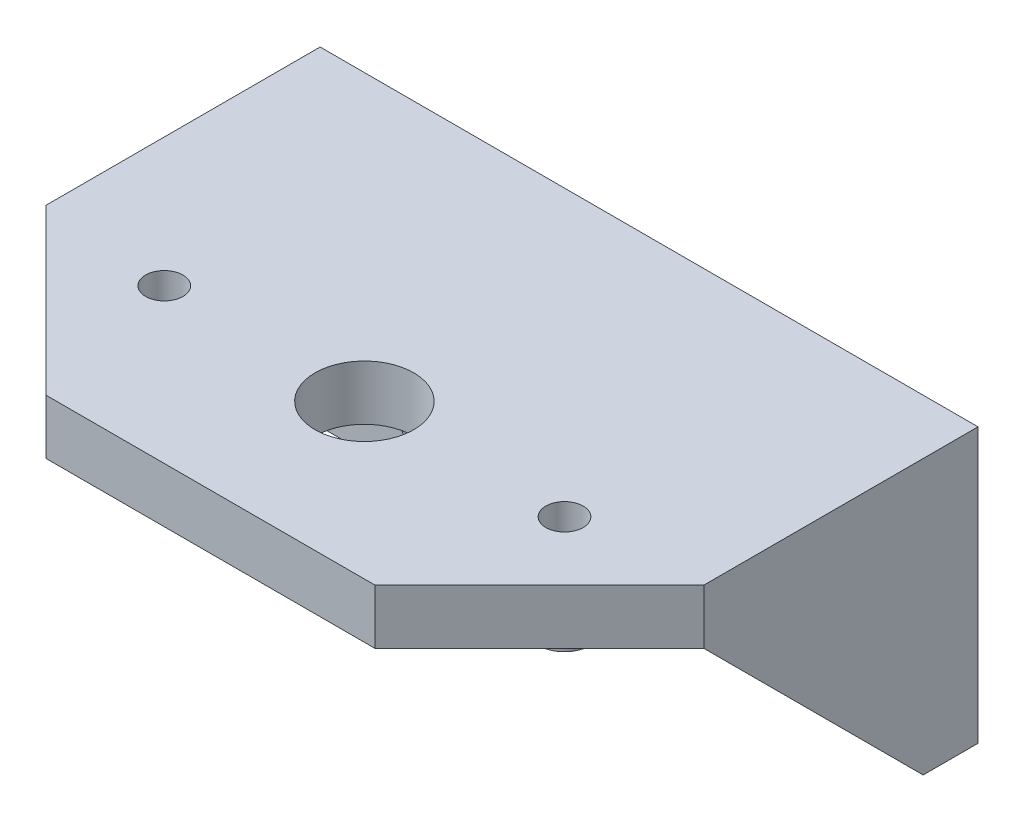
ISO-10303-21;
HEADER;
FILE_DESCRIPTION(('STEP AP214'),'2;1');
FILE_NAME('part.step','',(''),(''),'','','');
FILE_SCHEMA(('AUTOMOTIVE_DESIGN { 1 0 10303 214 1 1 1 1 }'));
ENDSEC;
DATA;
#1=APPLICATION_CONTEXT('core data for automotive mechanical design processes');
#2=APPLICATION_PROTOCOL_DEFINITION('international standard','automotive_design',2000,#1);
#3=PRODUCT_CONTEXT('',#1,'mechanical');
#4=PRODUCT('Part','Part','',(#3));
#5=PRODUCT_RELATED_PRODUCT_CATEGORY('part','',(#4));
#6=PRODUCT_DEFINITION_FORMATION('','',#4);
#7=PRODUCT_DEFINITION_CONTEXT('part definition',#1,'design');
#8=PRODUCT_DEFINITION('design','',#6,#7);
#9=PRODUCT_DEFINITION_SHAPE('','',#8);
#10=(LENGTH_UNIT() NAMED_UNIT(*) SI_UNIT(.MILLI.,.METRE.));
#11=(NAMED_UNIT(*) PLANE_ANGLE_UNIT() SI_UNIT($,.RADIAN.));
#12=(NAMED_UNIT(*) SI_UNIT($,.STERADIAN.) SOLID_ANGLE_UNIT());
#13=UNCERTAINTY_MEASURE_WITH_UNIT(LENGTH_MEASURE(1.E-05),#10,'distance_accuracy_value','');
#14=(GEOMETRIC_REPRESENTATION_CONTEXT(3) GLOBAL_UNCERTAINTY_ASSIGNED_CONTEXT((#13)) GLOBAL_UNIT_ASSIGNED_CONTEXT((#10,
#11,#12)) REPRESENTATION_CONTEXT('',''));
#15=CARTESIAN_POINT('',(0.,0.,0.));
#16=DIRECTION('',(0.,0.,1.));
#17=DIRECTION('',(1.,0.,0.));
#18=AXIS2_PLACEMENT_3D('',#15,#16,#17);
#19=CARTESIAN_POINT('',(0.,0.,5.));
#20=DIRECTION('',(0.,0.,1.));
#21=DIRECTION('',(1.,0.,0.));
#22=AXIS2_PLACEMENT_3D('',#19,#20,#21);
#23=PLANE('',#22);
#24=CARTESIAN_POINT('',(96.6237661627141,215.923622409628,5.));
#25=DIRECTION('',(0.,0.,1.));
#26=DIRECTION('',(1.,0.,0.));
#27=AXIS2_PLACEMENT_3D('',#24,#25,#26);
#28=CIRCLE('',#27,3.00000000000001);
#29=CARTESIAN_POINT('',(99.6237661627141,215.923622409628,5.));
#30=VERTEX_POINT('',#29);
#31=EDGE_CURVE('E178',#30,#30,#28,.T.);
#32=ORIENTED_EDGE('',*,*,#31,.F.);
#33=EDGE_LOOP('',(#32));
#34=FACE_BOUND('',#33,.T.);
#35=CARTESIAN_POINT('',(96.6237661627141,225.923622409628,5.));
#36=DIRECTION('',(0.,0.,1.));
#37=DIRECTION('',(1.,0.,0.));
#38=AXIS2_PLACEMENT_3D('',#35,#36,#37);
#39=CIRCLE('',#38,3.00000000000001);
#40=CARTESIAN_POINT('',(99.6237661627141,225.923622409628,5.));
#41=VERTEX_POINT('',#40);
#42=EDGE_CURVE('E189',#41,#41,#39,.T.);
#43=ORIENTED_EDGE('',*,*,#42,.F.);
#44=EDGE_LOOP('',(#43));
#45=FACE_BOUND('',#44,.T.);
#46=CARTESIAN_POINT('',(126.623766162714,225.9236224096,5.));
#47=DIRECTION('',(0.,0.,1.));
#48=DIRECTION('',(1.,0.,0.));
#49=AXIS2_PLACEMENT_3D('',#46,#47,#48);
#50=CIRCLE('',#49,3.0000000000083);
#51=CARTESIAN_POINT('',(129.623766162722,225.9236224096,5.));
#52=VERTEX_POINT('',#51);
#53=EDGE_CURVE('E183',#52,#52,#50,.T.);
#54=ORIENTED_EDGE('',*,*,#53,.F.);
#55=EDGE_LOOP('',(#54));
#56=FACE_BOUND('',#55,.T.);
#57=CARTESIAN_POINT('',(126.623766162714,215.923622409628,5.));
#58=DIRECTION('',(0.,0.,1.));
#59=DIRECTION('',(1.,0.,0.));
#60=AXIS2_PLACEMENT_3D('',#57,#58,#59);
#61=CIRCLE('',#60,2.99999999999999);
#62=CARTESIAN_POINT('',(129.623766162714,215.923622409628,5.));
#63=VERTEX_POINT('',#62);
#64=EDGE_CURVE('E182',#63,#63,#61,.T.);
#65=ORIENTED_EDGE('',*,*,#64,.F.);
#66=EDGE_LOOP('',(#65));
#67=FACE_BOUND('',#66,.T.);
#68=DIRECTION('',(1.,0.,0.));
#69=VECTOR('',#68,1.);
#70=CARTESIAN_POINT('',(0.,210.923622409628,5.));
#71=LINE('',#70,#69);
#72=CARTESIAN_POINT('',(84.6237661627141,210.923622409628,5.));
#73=VERTEX_POINT('',#72);
#74=CARTESIAN_POINT('',(138.623766162714,210.923622409628,5.));
#75=VERTEX_POINT('',#74);
#76=EDGE_CURVE('E222',#73,#75,#71,.T.);
#77=ORIENTED_EDGE('',*,*,#76,.T.);
#78=DIRECTION('',(0.,1.,0.));
#79=VECTOR('',#78,1.);
#80=CARTESIAN_POINT('',(138.623766162714,0.,5.));
#81=LINE('',#80,#79);
#82=CARTESIAN_POINT('',(138.623766162714,230.9236224096,5.));
#83=VERTEX_POINT('',#82);
#84=EDGE_CURVE('E59',#75,#83,#81,.T.);
#85=ORIENTED_EDGE('',*,*,#84,.T.);
#86=DIRECTION('',(1.,0.,0.));
#87=VECTOR('',#86,1.);
#88=CARTESIAN_POINT('',(-6.4861517815857E-13,230.9236224096,5.));
#89=LINE('',#88,#87);
#90=CARTESIAN_POINT('',(84.6237661627141,230.9236224096,5.));
#91=VERTEX_POINT('',#90);
#92=EDGE_CURVE('E206',#91,#83,#89,.T.);
#93=ORIENTED_EDGE('',*,*,#92,.F.);
#94=DIRECTION('',(0.,-1.,0.));
#95=VECTOR('',#94,1.);
#96=CARTESIAN_POINT('',(84.6237661627141,0.,5.));
#97=LINE('',#96,#95);
#98=EDGE_CURVE('E155',#91,#73,#97,.T.);
#99=ORIENTED_EDGE('',*,*,#98,.T.);
#100=EDGE_LOOP('',(#77,#85,#93,#99));
#101=FACE_BOUND('',#100,.T.);
#102=ADVANCED_FACE('F36',(#34,#45,#56,#67,#101),#23,.T.);
#103=CARTESIAN_POINT('',(-6.4861517815857E-13,230.9236224096,0.));
#104=DIRECTION('',(0.,1.,0.));
#105=DIRECTION('',(-1.,0.,0.));
#106=AXIS2_PLACEMENT_3D('',#103,#104,#105);
#107=PLANE('',#106);
#108=CARTESIAN_POINT('',(93.3737661626332,230.9236224096,25.9618967854097));
#109=DIRECTION('',(0.,1.,0.));
#110=DIRECTION('',(-1.,0.,0.));
#111=AXIS2_PLACEMENT_3D('',#108,#109,#110);
#112=CIRCLE('',#111,4.35000000000008);
#113=CARTESIAN_POINT('',(89.0237661626332,230.9236224096,25.9618967854097));
#114=VERTEX_POINT('',#113);
#115=EDGE_CURVE('E44',#114,#114,#112,.T.);
#116=ORIENTED_EDGE('',*,*,#115,.T.);
#117=EDGE_LOOP('',(#116));
#118=FACE_BOUND('',#117,.T.);
#119=CARTESIAN_POINT('',(129.873766162714,230.9236224096,25.96189678543));
#120=DIRECTION('',(0.,1.,0.));
#121=DIRECTION('',(-1.,0.,0.));
#122=AXIS2_PLACEMENT_3D('',#119,#120,#121);
#123=CIRCLE('',#122,4.35000000000005);
#124=CARTESIAN_POINT('',(125.523766162714,230.9236224096,25.96189678543));
#125=VERTEX_POINT('',#124);
#126=EDGE_CURVE('E278',#125,#125,#123,.T.);
#127=ORIENTED_EDGE('',*,*,#126,.T.);
#128=EDGE_LOOP('',(#127));
#129=FACE_BOUND('',#128,.T.);
#130=CARTESIAN_POINT('',(111.623766162714,230.9236224096,25.9618967848771));
#131=DIRECTION('',(0.,1.,0.));
#132=DIRECTION('',(-1.,0.,0.));
#133=AXIS2_PLACEMENT_3D('',#130,#131,#132);
#134=CIRCLE('',#133,4.4999999998442);
#135=CARTESIAN_POINT('',(107.12376616287,230.9236224096,25.9618967848771));
#136=VERTEX_POINT('',#135);
#137=EDGE_CURVE('E203',#136,#136,#134,.T.);
#138=ORIENTED_EDGE('',*,*,#137,.T.);
#139=EDGE_LOOP('',(#138));
#140=FACE_BOUND('',#139,.T.);
#141=DIRECTION('',(0.,0.,-1.));
#142=VECTOR('',#141,1.);
#143=CARTESIAN_POINT('',(138.623766162714,230.9236224096,0.));
#144=LINE('',#143,#142);
#145=CARTESIAN_POINT('',(138.623766162714,230.9236224096,24.9999999999999));
#146=VERTEX_POINT('',#145);
#147=EDGE_CURVE('E51',#146,#83,#144,.T.);
#148=ORIENTED_EDGE('',*,*,#147,.F.);
#149=DIRECTION('',(1.,0.,0.));
#150=VECTOR('',#149,1.);
#151=CARTESIAN_POINT('',(138.623766162714,230.9236224096,24.9999999999999));
#152=LINE('',#151,#150);
#153=CARTESIAN_POINT('',(141.623766162714,230.9236224096,24.9999999999999));
#154=VERTEX_POINT('',#153);
#155=EDGE_CURVE('E135',#146,#154,#152,.T.);
#156=ORIENTED_EDGE('',*,*,#155,.T.);
#157=DIRECTION('',(-0.707106781186548,0.,0.707106781186548));
#158=VECTOR('',#157,1.);
#159=CARTESIAN_POINT('',(126.623766162714,230.9236224096,40.));
#160=LINE('',#159,#158);
#161=CARTESIAN_POINT('',(126.623766162714,230.9236224096,40.));
#162=VERTEX_POINT('',#161);
#163=EDGE_CURVE('E270',#154,#162,#160,.T.);
#164=ORIENTED_EDGE('',*,*,#163,.T.);
#165=DIRECTION('',(1.,0.,0.));
#166=VECTOR('',#165,1.);
#167=CARTESIAN_POINT('',(-6.4861517815857E-13,230.9236224096,40.));
#168=LINE('',#167,#166);
#169=CARTESIAN_POINT('',(96.6237661627142,230.9236224096,40.));
#170=VERTEX_POINT('',#169);
#171=EDGE_CURVE('E209',#170,#162,#168,.T.);
#172=ORIENTED_EDGE('',*,*,#171,.F.);
#173=DIRECTION('',(0.707106781186548,0.,0.707106781186547));
#174=VECTOR('',#173,1.);
#175=CARTESIAN_POINT('',(81.6237661627138,230.9236224096,24.9999999999996));
#176=LINE('',#175,#174);
#177=CARTESIAN_POINT('',(81.6237661627141,230.9236224096,25.));
#178=VERTEX_POINT('',#177);
#179=EDGE_CURVE('E267',#170,#178,#176,.F.);
#180=ORIENTED_EDGE('',*,*,#179,.T.);
#181=DIRECTION('',(-1.,0.,0.));
#182=VECTOR('',#181,1.);
#183=CARTESIAN_POINT('',(84.6237661627141,230.9236224096,25.));
#184=LINE('',#183,#182);
#185=CARTESIAN_POINT('',(84.6237661627141,230.9236224096,25.));
#186=VERTEX_POINT('',#185);
#187=EDGE_CURVE('E152',#186,#178,#184,.T.);
#188=ORIENTED_EDGE('',*,*,#187,.F.);
#189=DIRECTION('',(0.,0.,1.));
#190=VECTOR('',#189,1.);
#191=CARTESIAN_POINT('',(84.6237661627141,230.9236224096,0.));
#192=LINE('',#191,#190);
#193=EDGE_CURVE('E158',#91,#186,#192,.T.);
#194=ORIENTED_EDGE('',*,*,#193,.F.);
#195=ORIENTED_EDGE('',*,*,#92,.T.);
#196=EDGE_LOOP('',(#148,#156,#164,#172,#180,#188,#194,#195));
#197=FACE_BOUND('',#196,.T.);
#198=ADVANCED_FACE('F283',(#118,#129,#140,#197),#107,.F.);
#199=CARTESIAN_POINT('',(96.6237661627141,225.923622409628,5.));
#200=DIRECTION('',(0.,0.,-1.));
#201=DIRECTION('',(-1.,0.,0.));
#202=AXIS2_PLACEMENT_3D('',#199,#200,#201);
#203=CYLINDRICAL_SURFACE('',#202,1.70000000000001);
#204=CARTESIAN_POINT('',(96.6237661627141,225.923622409628,0.));
#205=DIRECTION('',(0.,0.,1.));
#206=DIRECTION('',(1.,0.,0.));
#207=AXIS2_PLACEMENT_3D('',#204,#205,#206);
#208=CIRCLE('',#207,1.70000000000001);
#209=CARTESIAN_POINT('',(98.3237661627142,225.923622409628,0.));
#210=VERTEX_POINT('',#209);
#211=EDGE_CURVE('E237',#210,#210,#208,.T.);
#212=ORIENTED_EDGE('',*,*,#211,.F.);
#213=EDGE_LOOP('',(#212));
#214=FACE_BOUND('',#213,.T.);
#215=CARTESIAN_POINT('',(96.6237661627141,225.923622409628,2.));
#216=DIRECTION('',(0.,0.,1.));
#217=DIRECTION('',(1.,0.,0.));
#218=AXIS2_PLACEMENT_3D('',#215,#216,#217);
#219=CIRCLE('',#218,1.70000000000001);
#220=CARTESIAN_POINT('',(98.3237661627142,225.923622409628,2.));
#221=VERTEX_POINT('',#220);
#222=EDGE_CURVE('E215',#221,#221,#219,.T.);
#223=ORIENTED_EDGE('',*,*,#222,.T.);
#224=EDGE_LOOP('',(#223));
#225=FACE_BOUND('',#224,.T.);
#226=ADVANCED_FACE('F323',(#214,#225),#203,.F.);
#227=CARTESIAN_POINT('',(126.623766162714,225.9236224096,5.));
#228=DIRECTION('',(0.,0.,-1.));
#229=DIRECTION('',(-1.,0.,0.));
#230=AXIS2_PLACEMENT_3D('',#227,#228,#229);
#231=CYLINDRICAL_SURFACE('',#230,1.70000000000832);
#232=CARTESIAN_POINT('',(126.623766162714,225.9236224096,0.));
#233=DIRECTION('',(0.,0.,1.));
#234=DIRECTION('',(1.,0.,0.));
#235=AXIS2_PLACEMENT_3D('',#232,#233,#234);
#236=CIRCLE('',#235,1.70000000000832);
#237=CARTESIAN_POINT('',(128.323766162722,225.9236224096,0.));
#238=VERTEX_POINT('',#237);
#239=EDGE_CURVE('E234',#238,#238,#236,.T.);
#240=ORIENTED_EDGE('',*,*,#239,.F.);
#241=EDGE_LOOP('',(#240));
#242=FACE_BOUND('',#241,.T.);
#243=CARTESIAN_POINT('',(126.623766162714,225.9236224096,2.));
#244=DIRECTION('',(0.,0.,1.));
#245=DIRECTION('',(1.,0.,0.));
#246=AXIS2_PLACEMENT_3D('',#243,#244,#245);
#247=CIRCLE('',#246,1.70000000000832);
#248=CARTESIAN_POINT('',(128.323766162722,225.9236224096,2.));
#249=VERTEX_POINT('',#248);
#250=EDGE_CURVE('E253',#249,#249,#247,.T.);
#251=ORIENTED_EDGE('',*,*,#250,.T.);
#252=EDGE_LOOP('',(#251));
#253=FACE_BOUND('',#252,.T.);
#254=ADVANCED_FACE('F344',(#242,#253),#231,.F.);
#255=CARTESIAN_POINT('',(126.623766162714,215.923622409628,5.));
#256=DIRECTION('',(0.,0.,-1.));
#257=DIRECTION('',(-1.,0.,0.));
#258=AXIS2_PLACEMENT_3D('',#255,#256,#257);
#259=CYLINDRICAL_SURFACE('',#258,1.70000000000001);
#260=CARTESIAN_POINT('',(126.623766162714,215.923622409628,0.));
#261=DIRECTION('',(0.,0.,1.));
#262=DIRECTION('',(1.,0.,0.));
#263=AXIS2_PLACEMENT_3D('',#260,#261,#262);
#264=CIRCLE('',#263,1.70000000000001);
#265=CARTESIAN_POINT('',(128.323766162714,215.923622409628,0.));
#266=VERTEX_POINT('',#265);
#267=EDGE_CURVE('E231',#266,#266,#264,.T.);
#268=ORIENTED_EDGE('',*,*,#267,.F.);
#269=EDGE_LOOP('',(#268));
#270=FACE_BOUND('',#269,.T.);
#271=CARTESIAN_POINT('',(126.623766162714,215.923622409628,2.));
#272=DIRECTION('',(0.,0.,1.));
#273=DIRECTION('',(1.,0.,0.));
#274=AXIS2_PLACEMENT_3D('',#271,#272,#273);
#275=CIRCLE('',#274,1.70000000000001);
#276=CARTESIAN_POINT('',(128.323766162714,215.923622409628,2.));
#277=VERTEX_POINT('',#276);
#278=EDGE_CURVE('E250',#277,#277,#275,.T.);
#279=ORIENTED_EDGE('',*,*,#278,.T.);
#280=EDGE_LOOP('',(#279));
#281=FACE_BOUND('',#280,.T.);
#282=ADVANCED_FACE('F340',(#270,#281),#259,.F.);
#283=CARTESIAN_POINT('',(96.6237661627141,215.923622409628,5.));
#284=DIRECTION('',(0.,0.,-1.));
#285=DIRECTION('',(-1.,0.,0.));
#286=AXIS2_PLACEMENT_3D('',#283,#284,#285);
#287=CYLINDRICAL_SURFACE('',#286,1.70000000000001);
#288=CARTESIAN_POINT('',(96.6237661627141,215.923622409628,0.));
#289=DIRECTION('',(0.,0.,1.));
#290=DIRECTION('',(1.,0.,0.));
#291=AXIS2_PLACEMENT_3D('',#288,#289,#290);
#292=CIRCLE('',#291,1.70000000000001);
#293=CARTESIAN_POINT('',(98.3237661627142,215.923622409628,0.));
#294=VERTEX_POINT('',#293);
#295=EDGE_CURVE('E240',#294,#294,#292,.T.);
#296=ORIENTED_EDGE('',*,*,#295,.F.);
#297=EDGE_LOOP('',(#296));
#298=FACE_BOUND('',#297,.T.);
#299=CARTESIAN_POINT('',(96.6237661627141,215.923622409628,2.));
#300=DIRECTION('',(0.,0.,1.));
#301=DIRECTION('',(1.,0.,0.));
#302=AXIS2_PLACEMENT_3D('',#299,#300,#301);
#303=CIRCLE('',#302,1.70000000000001);
#304=CARTESIAN_POINT('',(98.3237661627142,215.923622409628,2.));
#305=VERTEX_POINT('',#304);
#306=EDGE_CURVE('E200',#305,#305,#303,.T.);
#307=ORIENTED_EDGE('',*,*,#306,.T.);
#308=EDGE_LOOP('',(#307));
#309=FACE_BOUND('',#308,.T.);
#310=ADVANCED_FACE('F337',(#298,#309),#287,.F.);
#311=CARTESIAN_POINT('',(0.,210.923622409628,5.));
#312=DIRECTION('',(0.,1.,0.));
#313=DIRECTION('',(0.,0.,1.));
#314=AXIS2_PLACEMENT_3D('',#311,#312,#313);
#315=PLANE('',#314);
#316=DIRECTION('',(1.,0.,0.));
#317=VECTOR('',#316,1.);
#318=CARTESIAN_POINT('',(138.623766162714,210.923622409628,5.));
#319=LINE('',#318,#317);
#320=CARTESIAN_POINT('',(141.623766162714,210.923622409628,5.));
#321=VERTEX_POINT('',#320);
#322=EDGE_CURVE('E118',#75,#321,#319,.T.);
#323=ORIENTED_EDGE('',*,*,#322,.F.);
#324=ORIENTED_EDGE('',*,*,#76,.F.);
#325=CARTESIAN_POINT('',(81.6237661627141,210.923622409628,5.));
#326=VERTEX_POINT('',#325);
#327=EDGE_CURVE('E218',#326,#73,#71,.T.);
#328=ORIENTED_EDGE('',*,*,#327,.F.);
#329=DIRECTION('',(0.,0.,-1.));
#330=VECTOR('',#329,1.);
#331=CARTESIAN_POINT('',(81.6237661627141,210.923622409628,5.));
#332=LINE('',#331,#330);
#333=CARTESIAN_POINT('',(81.6237661627141,210.923622409628,0.));
#334=VERTEX_POINT('',#333);
#335=EDGE_CURVE('E221',#326,#334,#332,.T.);
#336=ORIENTED_EDGE('',*,*,#335,.T.);
#337=DIRECTION('',(1.,0.,0.));
#338=VECTOR('',#337,1.);
#339=CARTESIAN_POINT('',(0.,210.923622409628,0.));
#340=LINE('',#339,#338);
#341=CARTESIAN_POINT('',(141.623766162714,210.923622409628,0.));
#342=VERTEX_POINT('',#341);
#343=EDGE_CURVE('E120',#334,#342,#340,.T.);
#344=ORIENTED_EDGE('',*,*,#343,.T.);
#345=DIRECTION('',(0.,0.,-1.));
#346=VECTOR('',#345,1.);
#347=CARTESIAN_POINT('',(141.623766162714,210.923622409628,5.));
#348=LINE('',#347,#346);
#349=EDGE_CURVE('E114',#321,#342,#348,.T.);
#350=ORIENTED_EDGE('',*,*,#349,.F.);
#351=EDGE_LOOP('',(#323,#324,#328,#336,#344,#350));
#352=FACE_BOUND('',#351,.T.);
#353=ADVANCED_FACE('F116',(#352),#315,.F.);
#354=CARTESIAN_POINT('',(141.623766162714,0.,5.));
#355=DIRECTION('',(-1.,0.,0.));
#356=DIRECTION('',(0.,0.,1.));
#357=AXIS2_PLACEMENT_3D('',#354,#355,#356);
#358=PLANE('',#357);
#359=DIRECTION('',(0.,0.,-1.));
#360=VECTOR('',#359,1.);
#361=CARTESIAN_POINT('',(141.623766162714,235.9236224096,5.));
#362=LINE('',#361,#360);
#363=CARTESIAN_POINT('',(141.623766162714,235.9236224096,24.9999999999999));
#364=VERTEX_POINT('',#363);
#365=CARTESIAN_POINT('',(141.623766162714,235.9236224096,0.));
#366=VERTEX_POINT('',#365);
#367=EDGE_CURVE('E126',#364,#366,#362,.T.);
#368=ORIENTED_EDGE('',*,*,#367,.F.);
#369=DIRECTION('',(0.,-1.,0.));
#370=VECTOR('',#369,1.);
#371=CARTESIAN_POINT('',(141.623766162714,230.9236224096,24.9999999999999));
#372=LINE('',#371,#370);
#373=EDGE_CURVE('E141',#364,#154,#372,.T.);
#374=ORIENTED_EDGE('',*,*,#373,.T.);
#375=DIRECTION('',(0.,0.707106781186055,0.70710678118704));
#376=VECTOR('',#375,1.);
#377=CARTESIAN_POINT('',(141.623766162714,102.961811204961,-102.961811204817));
#378=LINE('',#377,#376);
#379=EDGE_CURVE('E133',#321,#154,#378,.T.);
#380=ORIENTED_EDGE('',*,*,#379,.F.);
#381=ORIENTED_EDGE('',*,*,#349,.T.);
#382=DIRECTION('',(0.,1.,0.));
#383=VECTOR('',#382,1.);
#384=CARTESIAN_POINT('',(141.623766162714,0.,0.));
#385=LINE('',#384,#383);
#386=EDGE_CURVE('E224',#342,#366,#385,.T.);
#387=ORIENTED_EDGE('',*,*,#386,.T.);
#388=EDGE_LOOP('',(#368,#374,#380,#381,#387));
#389=FACE_BOUND('',#388,.T.);
#390=ADVANCED_FACE('F139',(#389),#358,.F.);
#391=CARTESIAN_POINT('',(0.,235.9236224096,5.));
#392=DIRECTION('',(0.,1.,0.));
#393=DIRECTION('',(0.,0.,1.));
#394=AXIS2_PLACEMENT_3D('',#391,#392,#393);
#395=PLANE('',#394);
#396=DIRECTION('',(0.707106781186548,0.,-0.707106781186548));
#397=VECTOR('',#396,1.);
#398=CARTESIAN_POINT('',(80.811883081357,235.9236224096,85.811883081357));
#399=LINE('',#398,#397);
#400=CARTESIAN_POINT('',(126.623766162714,235.9236224096,40.));
#401=VERTEX_POINT('',#400);
#402=EDGE_CURVE('E264',#401,#364,#399,.T.);
#403=ORIENTED_EDGE('',*,*,#402,.T.);
#404=ORIENTED_EDGE('',*,*,#367,.T.);
#405=DIRECTION('',(1.,0.,0.));
#406=VECTOR('',#405,1.);
#407=CARTESIAN_POINT('',(0.,235.9236224096,0.));
#408=LINE('',#407,#406);
#409=CARTESIAN_POINT('',(81.6237661627141,235.9236224096,0.));
#410=VERTEX_POINT('',#409);
#411=EDGE_CURVE('E226',#410,#366,#408,.T.);
#412=ORIENTED_EDGE('',*,*,#411,.F.);
#413=DIRECTION('',(0.,0.,-1.));
#414=VECTOR('',#413,1.);
#415=CARTESIAN_POINT('',(81.6237661627141,235.9236224096,5.));
#416=LINE('',#415,#414);
#417=CARTESIAN_POINT('',(81.6237661627141,235.9236224096,25.));
#418=VERTEX_POINT('',#417);
#419=EDGE_CURVE('E244',#418,#410,#416,.T.);
#420=ORIENTED_EDGE('',*,*,#419,.F.);
#421=DIRECTION('',(-0.707106781186548,0.,-0.707106781186547));
#422=VECTOR('',#421,1.);
#423=CARTESIAN_POINT('',(30.8118830813571,235.9236224096,-25.8118830813571));
#424=LINE('',#423,#422);
#425=CARTESIAN_POINT('',(96.6237661627142,235.9236224096,40.));
#426=VERTEX_POINT('',#425);
#427=EDGE_CURVE('E262',#418,#426,#424,.F.);
#428=ORIENTED_EDGE('',*,*,#427,.T.);
#429=DIRECTION('',(1.,0.,0.));
#430=VECTOR('',#429,1.);
#431=CARTESIAN_POINT('',(-6.62492965966384E-13,235.9236224096,40.));
#432=LINE('',#431,#430);
#433=EDGE_CURVE('E207',#426,#401,#432,.T.);
#434=ORIENTED_EDGE('',*,*,#433,.T.);
#435=EDGE_LOOP('',(#403,#404,#412,#420,#428,#434));
#436=FACE_BOUND('',#435,.T.);
#437=CARTESIAN_POINT('',(111.623766162714,235.9236224096,25.9618967848771));
#438=DIRECTION('',(0.,1.,0.));
#439=DIRECTION('',(-1.,0.,0.));
#440=AXIS2_PLACEMENT_3D('',#437,#438,#439);
#441=CIRCLE('',#440,4.4999999998442);
#442=CARTESIAN_POINT('',(107.12376616287,235.9236224096,25.9618967848771));
#443=VERTEX_POINT('',#442);
#444=EDGE_CURVE('E212',#443,#443,#441,.T.);
#445=ORIENTED_EDGE('',*,*,#444,.F.);
#446=EDGE_LOOP('',(#445));
#447=FACE_BOUND('',#446,.T.);
#448=CARTESIAN_POINT('',(129.873766162714,235.9236224096,25.96189678543));
#449=DIRECTION('',(0.,1.,0.));
#450=DIRECTION('',(0.,0.,1.));
#451=AXIS2_PLACEMENT_3D('',#448,#449,#450);
#452=CIRCLE('',#451,1.70000000000001);
#453=CARTESIAN_POINT('',(129.873766162714,235.9236224096,27.66189678543));
#454=VERTEX_POINT('',#453);
#455=EDGE_CURVE('E175',#454,#454,#452,.T.);
#456=ORIENTED_EDGE('',*,*,#455,.F.);
#457=EDGE_LOOP('',(#456));
#458=FACE_BOUND('',#457,.T.);
#459=CARTESIAN_POINT('',(93.3737661626332,235.9236224096,25.9618967854097));
#460=DIRECTION('',(0.,1.,0.));
#461=DIRECTION('',(0.,0.,1.));
#462=AXIS2_PLACEMENT_3D('',#459,#460,#461);
#463=CIRCLE('',#462,1.7);
#464=CARTESIAN_POINT('',(93.3737661626332,235.9236224096,27.6618967854097));
#465=VERTEX_POINT('',#464);
#466=EDGE_CURVE('E166',#465,#465,#463,.T.);
#467=ORIENTED_EDGE('',*,*,#466,.F.);
#468=EDGE_LOOP('',(#467));
#469=FACE_BOUND('',#468,.T.);
#470=ADVANCED_FACE('F354',(#436,#447,#458,#469),#395,.T.);
#471=CARTESIAN_POINT('',(81.6237661627141,0.,5.));
#472=DIRECTION('',(-1.,0.,0.));
#473=DIRECTION('',(0.,0.,1.));
#474=AXIS2_PLACEMENT_3D('',#471,#472,#473);
#475=PLANE('',#474);
#476=DIRECTION('',(0.,-0.707106781186052,-0.707106781187043));
#477=VECTOR('',#476,1.);
#478=CARTESIAN_POINT('',(81.6237661627141,102.961811204962,-102.961811204817));
#479=LINE('',#478,#477);
#480=EDGE_CURVE('E149',#178,#326,#479,.T.);
#481=ORIENTED_EDGE('',*,*,#480,.F.);
#482=DIRECTION('',(0.,1.,0.));
#483=VECTOR('',#482,1.);
#484=CARTESIAN_POINT('',(81.6237661627141,0.,25.));
#485=LINE('',#484,#483);
#486=EDGE_CURVE('E272',#178,#418,#485,.T.);
#487=ORIENTED_EDGE('',*,*,#486,.T.);
#488=ORIENTED_EDGE('',*,*,#419,.T.);
#489=DIRECTION('',(0.,1.,0.));
#490=VECTOR('',#489,1.);
#491=CARTESIAN_POINT('',(81.6237661627141,0.,0.));
#492=LINE('',#491,#490);
#493=EDGE_CURVE('E228',#334,#410,#492,.T.);
#494=ORIENTED_EDGE('',*,*,#493,.F.);
#495=ORIENTED_EDGE('',*,*,#335,.F.);
#496=EDGE_LOOP('',(#481,#487,#488,#494,#495));
#497=FACE_BOUND('',#496,.T.);
#498=ADVANCED_FACE('F335',(#497),#475,.T.);
#499=CARTESIAN_POINT('',(0.,0.,0.));
#500=DIRECTION('',(0.,0.,1.));
#501=DIRECTION('',(1.,0.,0.));
#502=AXIS2_PLACEMENT_3D('',#499,#500,#501);
#503=PLANE('',#502);
#504=ORIENTED_EDGE('',*,*,#386,.F.);
#505=ORIENTED_EDGE('',*,*,#343,.F.);
#506=ORIENTED_EDGE('',*,*,#493,.T.);
#507=ORIENTED_EDGE('',*,*,#411,.T.);
#508=EDGE_LOOP('',(#504,#505,#506,#507));
#509=FACE_BOUND('',#508,.T.);
#510=ORIENTED_EDGE('',*,*,#267,.T.);
#511=EDGE_LOOP('',(#510));
#512=FACE_BOUND('',#511,.T.);
#513=ORIENTED_EDGE('',*,*,#239,.T.);
#514=EDGE_LOOP('',(#513));
#515=FACE_BOUND('',#514,.T.);
#516=ORIENTED_EDGE('',*,*,#211,.T.);
#517=EDGE_LOOP('',(#516));
#518=FACE_BOUND('',#517,.T.);
#519=ORIENTED_EDGE('',*,*,#295,.T.);
#520=EDGE_LOOP('',(#519));
#521=FACE_BOUND('',#520,.T.);
#522=ADVANCED_FACE('F331',(#509,#512,#515,#518,#521),#503,.F.);
#523=CARTESIAN_POINT('',(-6.4861517815857E-13,230.9236224096,40.));
#524=DIRECTION('',(0.,0.,1.));
#525=DIRECTION('',(1.,0.,0.));
#526=AXIS2_PLACEMENT_3D('',#523,#524,#525);
#527=PLANE('',#526);
#528=ORIENTED_EDGE('',*,*,#171,.T.);
#529=DIRECTION('',(0.,1.,0.));
#530=VECTOR('',#529,1.);
#531=CARTESIAN_POINT('',(126.623766162714,235.9236224096,40.));
#532=LINE('',#531,#530);
#533=EDGE_CURVE('E259',#162,#401,#532,.T.);
#534=ORIENTED_EDGE('',*,*,#533,.T.);
#535=ORIENTED_EDGE('',*,*,#433,.F.);
#536=DIRECTION('',(0.,-1.,0.));
#537=VECTOR('',#536,1.);
#538=CARTESIAN_POINT('',(96.6237661627142,230.9236224096,40.));
#539=LINE('',#538,#537);
#540=EDGE_CURVE('E125',#426,#170,#539,.T.);
#541=ORIENTED_EDGE('',*,*,#540,.T.);
#542=EDGE_LOOP('',(#528,#534,#535,#541));
#543=FACE_BOUND('',#542,.T.);
#544=ADVANCED_FACE('F334',(#543),#527,.T.);
#545=CARTESIAN_POINT('',(111.623766162714,230.9236224096,25.9618967848771));
#546=DIRECTION('',(0.,1.,0.));
#547=DIRECTION('',(-1.,0.,0.));
#548=AXIS2_PLACEMENT_3D('',#545,#546,#547);
#549=CYLINDRICAL_SURFACE('',#548,4.4999999998442);
#550=ORIENTED_EDGE('',*,*,#137,.F.);
#551=EDGE_LOOP('',(#550));
#552=FACE_BOUND('',#551,.T.);
#553=ORIENTED_EDGE('',*,*,#444,.T.);
#554=EDGE_LOOP('',(#553));
#555=FACE_BOUND('',#554,.T.);
#556=ADVANCED_FACE('F329',(#552,#555),#549,.F.);
#557=CARTESIAN_POINT('',(126.623766162714,215.923622409628,2.));
#558=DIRECTION('',(0.,0.,1.));
#559=DIRECTION('',(1.,0.,0.));
#560=AXIS2_PLACEMENT_3D('',#557,#558,#559);
#561=CYLINDRICAL_SURFACE('',#560,2.99999999999999);
#562=CARTESIAN_POINT('',(126.623766162714,215.923622409628,2.));
#563=DIRECTION('',(0.,0.,1.));
#564=DIRECTION('',(1.,0.,0.));
#565=AXIS2_PLACEMENT_3D('',#562,#563,#564);
#566=CIRCLE('',#565,2.99999999999999);
#567=CARTESIAN_POINT('',(129.623766162714,215.923622409628,2.));
#568=VERTEX_POINT('',#567);
#569=EDGE_CURVE('E197',#568,#568,#566,.T.);
#570=ORIENTED_EDGE('',*,*,#569,.F.);
#571=EDGE_LOOP('',(#570));
#572=FACE_BOUND('',#571,.T.);
#573=ORIENTED_EDGE('',*,*,#64,.T.);
#574=EDGE_LOOP('',(#573));
#575=FACE_BOUND('',#574,.T.);
#576=ADVANCED_FACE('F508',(#572,#575),#561,.F.);
#577=CARTESIAN_POINT('',(126.623766162714,215.923622409628,2.));
#578=DIRECTION('',(0.,0.,1.));
#579=DIRECTION('',(1.,0.,0.));
#580=AXIS2_PLACEMENT_3D('',#577,#578,#579);
#581=PLANE('',#580);
#582=ORIENTED_EDGE('',*,*,#278,.F.);
#583=EDGE_LOOP('',(#582));
#584=FACE_BOUND('',#583,.T.);
#585=ORIENTED_EDGE('',*,*,#569,.T.);
#586=EDGE_LOOP('',(#585));
#587=FACE_BOUND('',#586,.T.);
#588=ADVANCED_FACE('F494',(#584,#587),#581,.T.);
#589=CARTESIAN_POINT('',(126.623766162714,225.9236224096,2.));
#590=DIRECTION('',(0.,0.,1.));
#591=DIRECTION('',(1.,0.,0.));
#592=AXIS2_PLACEMENT_3D('',#589,#590,#591);
#593=CYLINDRICAL_SURFACE('',#592,3.0000000000083);
#594=CARTESIAN_POINT('',(126.623766162714,225.9236224096,2.));
#595=DIRECTION('',(0.,0.,1.));
#596=DIRECTION('',(1.,0.,0.));
#597=AXIS2_PLACEMENT_3D('',#594,#595,#596);
#598=CIRCLE('',#597,3.0000000000083);
#599=CARTESIAN_POINT('',(129.623766162722,225.9236224096,2.));
#600=VERTEX_POINT('',#599);
#601=EDGE_CURVE('E179',#600,#600,#598,.T.);
#602=ORIENTED_EDGE('',*,*,#601,.F.);
#603=EDGE_LOOP('',(#602));
#604=FACE_BOUND('',#603,.T.);
#605=ORIENTED_EDGE('',*,*,#53,.T.);
#606=EDGE_LOOP('',(#605));
#607=FACE_BOUND('',#606,.T.);
#608=ADVANCED_FACE('F490',(#604,#607),#593,.F.);
#609=CARTESIAN_POINT('',(126.623766162714,225.9236224096,2.));
#610=DIRECTION('',(0.,0.,1.));
#611=DIRECTION('',(1.,0.,0.));
#612=AXIS2_PLACEMENT_3D('',#609,#610,#611);
#613=PLANE('',#612);
#614=ORIENTED_EDGE('',*,*,#250,.F.);
#615=EDGE_LOOP('',(#614));
#616=FACE_BOUND('',#615,.T.);
#617=ORIENTED_EDGE('',*,*,#601,.T.);
#618=EDGE_LOOP('',(#617));
#619=FACE_BOUND('',#618,.T.);
#620=ADVANCED_FACE('F486',(#616,#619),#613,.T.);
#621=CARTESIAN_POINT('',(96.6237661627141,225.923622409628,2.));
#622=DIRECTION('',(0.,0.,1.));
#623=DIRECTION('',(1.,0.,0.));
#624=AXIS2_PLACEMENT_3D('',#621,#622,#623);
#625=CYLINDRICAL_SURFACE('',#624,3.00000000000001);
#626=CARTESIAN_POINT('',(96.6237661627141,225.923622409628,2.));
#627=DIRECTION('',(0.,0.,1.));
#628=DIRECTION('',(1.,0.,0.));
#629=AXIS2_PLACEMENT_3D('',#626,#627,#628);
#630=CIRCLE('',#629,3.00000000000001);
#631=CARTESIAN_POINT('',(99.6237661627141,225.923622409628,2.));
#632=VERTEX_POINT('',#631);
#633=EDGE_CURVE('E186',#632,#632,#630,.T.);
#634=ORIENTED_EDGE('',*,*,#633,.F.);
#635=EDGE_LOOP('',(#634));
#636=FACE_BOUND('',#635,.T.);
#637=ORIENTED_EDGE('',*,*,#42,.T.);
#638=EDGE_LOOP('',(#637));
#639=FACE_BOUND('',#638,.T.);
#640=ADVANCED_FACE('F489',(#636,#639),#625,.F.);
#641=CARTESIAN_POINT('',(96.6237661627141,225.923622409628,2.));
#642=DIRECTION('',(0.,0.,1.));
#643=DIRECTION('',(1.,0.,0.));
#644=AXIS2_PLACEMENT_3D('',#641,#642,#643);
#645=PLANE('',#644);
#646=ORIENTED_EDGE('',*,*,#222,.F.);
#647=EDGE_LOOP('',(#646));
#648=FACE_BOUND('',#647,.T.);
#649=ORIENTED_EDGE('',*,*,#633,.T.);
#650=EDGE_LOOP('',(#649));
#651=FACE_BOUND('',#650,.T.);
#652=ADVANCED_FACE('F496',(#648,#651),#645,.T.);
#653=CARTESIAN_POINT('',(96.6237661627141,215.923622409628,2.));
#654=DIRECTION('',(0.,0.,1.));
#655=DIRECTION('',(1.,0.,0.));
#656=AXIS2_PLACEMENT_3D('',#653,#654,#655);
#657=CYLINDRICAL_SURFACE('',#656,3.00000000000001);
#658=CARTESIAN_POINT('',(96.6237661627141,215.923622409628,2.));
#659=DIRECTION('',(0.,0.,1.));
#660=DIRECTION('',(1.,0.,0.));
#661=AXIS2_PLACEMENT_3D('',#658,#659,#660);
#662=CIRCLE('',#661,3.00000000000001);
#663=CARTESIAN_POINT('',(99.6237661627141,215.923622409628,2.));
#664=VERTEX_POINT('',#663);
#665=EDGE_CURVE('E192',#664,#664,#662,.T.);
#666=ORIENTED_EDGE('',*,*,#665,.F.);
#667=EDGE_LOOP('',(#666));
#668=FACE_BOUND('',#667,.T.);
#669=ORIENTED_EDGE('',*,*,#31,.T.);
#670=EDGE_LOOP('',(#669));
#671=FACE_BOUND('',#670,.T.);
#672=ADVANCED_FACE('F482',(#668,#671),#657,.F.);
#673=CARTESIAN_POINT('',(96.6237661627141,215.923622409628,2.));
#674=DIRECTION('',(0.,0.,1.));
#675=DIRECTION('',(1.,0.,0.));
#676=AXIS2_PLACEMENT_3D('',#673,#674,#675);
#677=PLANE('',#676);
#678=ORIENTED_EDGE('',*,*,#306,.F.);
#679=EDGE_LOOP('',(#678));
#680=FACE_BOUND('',#679,.T.);
#681=ORIENTED_EDGE('',*,*,#665,.T.);
#682=EDGE_LOOP('',(#681));
#683=FACE_BOUND('',#682,.T.);
#684=ADVANCED_FACE('F476',(#680,#683),#677,.T.);
#685=CARTESIAN_POINT('',(129.873766162714,243.919484110973,25.96189678543));
#686=DIRECTION('',(0.,-1.,0.));
#687=DIRECTION('',(1.,0.,0.));
#688=AXIS2_PLACEMENT_3D('',#685,#686,#687);
#689=CYLINDRICAL_SURFACE('',#688,1.70000000000001);
#690=ORIENTED_EDGE('',*,*,#455,.T.);
#691=EDGE_LOOP('',(#690));
#692=FACE_BOUND('',#691,.T.);
#693=CARTESIAN_POINT('',(129.873766162714,226.9236224096,25.96189678543));
#694=DIRECTION('',(0.,-1.,0.));
#695=DIRECTION('',(1.,0.,0.));
#696=AXIS2_PLACEMENT_3D('',#693,#694,#695);
#697=CIRCLE('',#696,1.70000000000001);
#698=CARTESIAN_POINT('',(131.573766162714,226.9236224096,25.96189678543));
#699=VERTEX_POINT('',#698);
#700=EDGE_CURVE('E169',#699,#699,#697,.T.);
#701=ORIENTED_EDGE('',*,*,#700,.T.);
#702=EDGE_LOOP('',(#701));
#703=FACE_BOUND('',#702,.T.);
#704=ADVANCED_FACE('F472',(#692,#703),#689,.F.);
#705=CARTESIAN_POINT('',(129.873766162714,226.9236224096,25.96189678543));
#706=DIRECTION('',(0.,-1.,0.));
#707=DIRECTION('',(1.,0.,0.));
#708=AXIS2_PLACEMENT_3D('',#705,#706,#707);
#709=PLANE('',#708);
#710=CARTESIAN_POINT('',(129.873766162714,226.9236224096,25.96189678543));
#711=DIRECTION('',(0.,-1.,0.));
#712=DIRECTION('',(1.,0.,0.));
#713=AXIS2_PLACEMENT_3D('',#710,#711,#712);
#714=CIRCLE('',#713,2.35);
#715=CARTESIAN_POINT('',(132.223766162714,226.9236224096,25.96189678543));
#716=VERTEX_POINT('',#715);
#717=EDGE_CURVE('E172',#716,#716,#714,.T.);
#718=ORIENTED_EDGE('',*,*,#717,.T.);
#719=EDGE_LOOP('',(#718));
#720=FACE_BOUND('',#719,.T.);
#721=ORIENTED_EDGE('',*,*,#700,.F.);
#722=EDGE_LOOP('',(#721));
#723=FACE_BOUND('',#722,.T.);
#724=ADVANCED_FACE('F313',(#720,#723),#709,.T.);
#725=CARTESIAN_POINT('',(129.873766162714,226.9236224096,25.96189678543));
#726=DIRECTION('',(0.,1.,0.));
#727=DIRECTION('',(-1.,0.,0.));
#728=AXIS2_PLACEMENT_3D('',#725,#726,#727);
#729=CYLINDRICAL_SURFACE('',#728,2.35);
#730=CARTESIAN_POINT('',(129.873766162714,229.9236224096,25.96189678543));
#731=DIRECTION('',(0.,1.,0.));
#732=DIRECTION('',(0.,0.,1.));
#733=AXIS2_PLACEMENT_3D('',#730,#731,#732);
#734=CIRCLE('',#733,2.35);
#735=CARTESIAN_POINT('',(129.873766162714,229.9236224096,28.31189678543));
#736=VERTEX_POINT('',#735);
#737=EDGE_CURVE('E11',#736,#736,#734,.F.);
#738=ORIENTED_EDGE('',*,*,#737,.T.);
#739=EDGE_LOOP('',(#738));
#740=FACE_BOUND('',#739,.T.);
#741=ORIENTED_EDGE('',*,*,#717,.F.);
#742=EDGE_LOOP('',(#741));
#743=FACE_BOUND('',#742,.T.);
#744=ADVANCED_FACE('F307',(#740,#743),#729,.T.);
#745=CARTESIAN_POINT('',(93.3737661626332,243.919484110973,25.9618967854097));
#746=DIRECTION('',(0.,-1.,0.));
#747=DIRECTION('',(1.,0.,0.));
#748=AXIS2_PLACEMENT_3D('',#745,#746,#747);
#749=CYLINDRICAL_SURFACE('',#748,1.7);
#750=ORIENTED_EDGE('',*,*,#466,.T.);
#751=EDGE_LOOP('',(#750));
#752=FACE_BOUND('',#751,.T.);
#753=CARTESIAN_POINT('',(93.3737661626333,226.9236224096,25.9618967854097));
#754=DIRECTION('',(0.,-1.,0.));
#755=DIRECTION('',(1.,0.,0.));
#756=AXIS2_PLACEMENT_3D('',#753,#754,#755);
#757=CIRCLE('',#756,1.7);
#758=CARTESIAN_POINT('',(95.0737661626333,226.9236224096,25.9618967854097));
#759=VERTEX_POINT('',#758);
#760=EDGE_CURVE('E160',#759,#759,#757,.T.);
#761=ORIENTED_EDGE('',*,*,#760,.T.);
#762=EDGE_LOOP('',(#761));
#763=FACE_BOUND('',#762,.T.);
#764=ADVANCED_FACE('F302',(#752,#763),#749,.F.);
#765=CARTESIAN_POINT('',(93.3737661626333,226.9236224096,25.9618967854097));
#766=DIRECTION('',(0.,-1.,0.));
#767=DIRECTION('',(1.,0.,0.));
#768=AXIS2_PLACEMENT_3D('',#765,#766,#767);
#769=PLANE('',#768);
#770=CARTESIAN_POINT('',(93.3737661626333,226.9236224096,25.9618967854097));
#771=DIRECTION('',(0.,-1.,0.));
#772=DIRECTION('',(1.,0.,0.));
#773=AXIS2_PLACEMENT_3D('',#770,#771,#772);
#774=CIRCLE('',#773,2.35);
#775=CARTESIAN_POINT('',(95.7237661626333,226.9236224096,25.9618967854097));
#776=VERTEX_POINT('',#775);
#777=EDGE_CURVE('E163',#776,#776,#774,.T.);
#778=ORIENTED_EDGE('',*,*,#777,.T.);
#779=EDGE_LOOP('',(#778));
#780=FACE_BOUND('',#779,.T.);
#781=ORIENTED_EDGE('',*,*,#760,.F.);
#782=EDGE_LOOP('',(#781));
#783=FACE_BOUND('',#782,.T.);
#784=ADVANCED_FACE('F296',(#780,#783),#769,.T.);
#785=CARTESIAN_POINT('',(93.3737661626333,226.9236224096,25.9618967854097));
#786=DIRECTION('',(0.,1.,0.));
#787=DIRECTION('',(-1.,0.,0.));
#788=AXIS2_PLACEMENT_3D('',#785,#786,#787);
#789=CYLINDRICAL_SURFACE('',#788,2.35);
#790=CARTESIAN_POINT('',(93.3737661626332,229.9236224096,25.9618967854097));
#791=DIRECTION('',(0.,1.,0.));
#792=DIRECTION('',(0.,0.,1.));
#793=AXIS2_PLACEMENT_3D('',#790,#791,#792);
#794=CIRCLE('',#793,2.35);
#795=CARTESIAN_POINT('',(93.3737661626332,229.9236224096,28.3118967854097));
#796=VERTEX_POINT('',#795);
#797=EDGE_CURVE('E275',#796,#796,#794,.F.);
#798=ORIENTED_EDGE('',*,*,#797,.T.);
#799=EDGE_LOOP('',(#798));
#800=FACE_BOUND('',#799,.T.);
#801=ORIENTED_EDGE('',*,*,#777,.F.);
#802=EDGE_LOOP('',(#801));
#803=FACE_BOUND('',#802,.T.);
#804=ADVANCED_FACE('F292',(#800,#803),#789,.T.);
#805=CARTESIAN_POINT('',(126.623766162714,230.9236224096,40.));
#806=DIRECTION('',(0.707106781186547,0.,0.707106781186547));
#807=DIRECTION('',(0.,-1.,0.));
#808=AXIS2_PLACEMENT_3D('',#805,#806,#807);
#809=PLANE('',#808);
#810=ORIENTED_EDGE('',*,*,#163,.F.);
#811=ORIENTED_EDGE('',*,*,#373,.F.);
#812=ORIENTED_EDGE('',*,*,#402,.F.);
#813=ORIENTED_EDGE('',*,*,#533,.F.);
#814=EDGE_LOOP('',(#810,#811,#812,#813));
#815=FACE_BOUND('',#814,.T.);
#816=ADVANCED_FACE('F295',(#815),#809,.T.);
#817=CARTESIAN_POINT('',(81.6237661627141,0.,25.));
#818=DIRECTION('',(0.707106781186547,0.,-0.707106781186548));
#819=DIRECTION('',(0.,1.,0.));
#820=AXIS2_PLACEMENT_3D('',#817,#818,#819);
#821=PLANE('',#820);
#822=ORIENTED_EDGE('',*,*,#179,.F.);
#823=ORIENTED_EDGE('',*,*,#540,.F.);
#824=ORIENTED_EDGE('',*,*,#427,.F.);
#825=ORIENTED_EDGE('',*,*,#486,.F.);
#826=EDGE_LOOP('',(#822,#823,#824,#825));
#827=FACE_BOUND('',#826,.T.);
#828=ADVANCED_FACE('F365',(#827),#821,.F.);
#829=CARTESIAN_POINT('',(84.6237661627141,0.,0.));
#830=DIRECTION('',(-1.,0.,0.));
#831=DIRECTION('',(0.,0.,1.));
#832=AXIS2_PLACEMENT_3D('',#829,#830,#831);
#833=PLANE('',#832);
#834=ORIENTED_EDGE('',*,*,#98,.F.);
#835=ORIENTED_EDGE('',*,*,#193,.T.);
#836=DIRECTION('',(0.,-0.707106781186052,-0.707106781187043));
#837=VECTOR('',#836,1.);
#838=CARTESIAN_POINT('',(84.6237661627141,102.961811204962,-102.961811204817));
#839=LINE('',#838,#837);
#840=EDGE_CURVE('E150',#186,#73,#839,.T.);
#841=ORIENTED_EDGE('',*,*,#840,.T.);
#842=EDGE_LOOP('',(#834,#835,#841));
#843=FACE_BOUND('',#842,.T.);
#844=ADVANCED_FACE('F368',(#843),#833,.F.);
#845=CARTESIAN_POINT('',(84.6237661627141,102.961811204962,-102.961811204817));
#846=DIRECTION('',(0.,0.707106781187043,-0.707106781186052));
#847=DIRECTION('',(0.,0.707106781186052,0.707106781187043));
#848=AXIS2_PLACEMENT_3D('',#845,#846,#847);
#849=PLANE('',#848);
#850=ORIENTED_EDGE('',*,*,#480,.T.);
#851=ORIENTED_EDGE('',*,*,#327,.T.);
#852=ORIENTED_EDGE('',*,*,#840,.F.);
#853=ORIENTED_EDGE('',*,*,#187,.T.);
#854=EDGE_LOOP('',(#850,#851,#852,#853));
#855=FACE_BOUND('',#854,.T.);
#856=ADVANCED_FACE('F373',(#855),#849,.F.);
#857=CARTESIAN_POINT('',(138.623766162714,102.961811204961,-102.961811204817));
#858=DIRECTION('',(0.,0.70710678118704,-0.707106781186055));
#859=DIRECTION('',(0.,0.707106781186055,0.70710678118704));
#860=AXIS2_PLACEMENT_3D('',#857,#858,#859);
#861=PLANE('',#860);
#862=ORIENTED_EDGE('',*,*,#379,.T.);
#863=ORIENTED_EDGE('',*,*,#155,.F.);
#864=DIRECTION('',(0.,0.707106781186055,0.70710678118704));
#865=VECTOR('',#864,1.);
#866=CARTESIAN_POINT('',(138.623766162714,102.961811204961,-102.961811204817));
#867=LINE('',#866,#865);
#868=EDGE_CURVE('E134',#75,#146,#867,.T.);
#869=ORIENTED_EDGE('',*,*,#868,.F.);
#870=ORIENTED_EDGE('',*,*,#322,.T.);
#871=EDGE_LOOP('',(#862,#863,#869,#870));
#872=FACE_BOUND('',#871,.T.);
#873=ADVANCED_FACE('F131',(#872),#861,.F.);
#874=CARTESIAN_POINT('',(138.623766162714,0.,0.));
#875=DIRECTION('',(1.,0.,0.));
#876=DIRECTION('',(0.,0.,-1.));
#877=AXIS2_PLACEMENT_3D('',#874,#875,#876);
#878=PLANE('',#877);
#879=ORIENTED_EDGE('',*,*,#84,.F.);
#880=ORIENTED_EDGE('',*,*,#868,.T.);
#881=ORIENTED_EDGE('',*,*,#147,.T.);
#882=EDGE_LOOP('',(#879,#880,#881));
#883=FACE_BOUND('',#882,.T.);
#884=ADVANCED_FACE('F289',(#883),#878,.F.);
#885=CARTESIAN_POINT('',(93.3737661626332,229.9236224096,25.9618967854097));
#886=DIRECTION('',(0.,1.,0.));
#887=DIRECTION('',(0.,0.,1.));
#888=AXIS2_PLACEMENT_3D('',#885,#886,#887);
#889=CONICAL_SURFACE('',#888,2.35,1.10714871779409);
#890=ORIENTED_EDGE('',*,*,#115,.F.);
#891=EDGE_LOOP('',(#890));
#892=FACE_BOUND('',#891,.T.);
#893=ORIENTED_EDGE('',*,*,#797,.F.);
#894=EDGE_LOOP('',(#893));
#895=FACE_BOUND('',#894,.T.);
#896=ADVANCED_FACE('F286',(#892,#895),#889,.T.);
#897=CARTESIAN_POINT('',(129.873766162714,229.9236224096,25.96189678543));
#898=DIRECTION('',(0.,1.,0.));
#899=DIRECTION('',(0.,0.,1.));
#900=AXIS2_PLACEMENT_3D('',#897,#898,#899);
#901=CONICAL_SURFACE('',#900,2.35,1.10714871779411);
#902=ORIENTED_EDGE('',*,*,#126,.F.);
#903=EDGE_LOOP('',(#902));
#904=FACE_BOUND('',#903,.T.);
#905=ORIENTED_EDGE('',*,*,#737,.F.);
#906=EDGE_LOOP('',(#905));
#907=FACE_BOUND('',#906,.T.);
#908=ADVANCED_FACE('F38',(#904,#907),#901,.T.);
#909=CLOSED_SHELL('',(#102,#198,#226,#254,#282,#310,#353,#390,#470,#498,#522,#544,#556,#576,
#588,#608,#620,#640,#652,#672,#684,#704,#724,#744,#764,#784,#804,#816,#828,#844,#856,#873,#884,
#896,#908));
#910=MANIFOLD_SOLID_BREP('B2',#909);
#911=ADVANCED_BREP_SHAPE_REPRESENTATION('',(#18,#910),#14);
#912=SHAPE_DEFINITION_REPRESENTATION(#9,#911);
ENDSEC;
END-ISO-10303-21;
